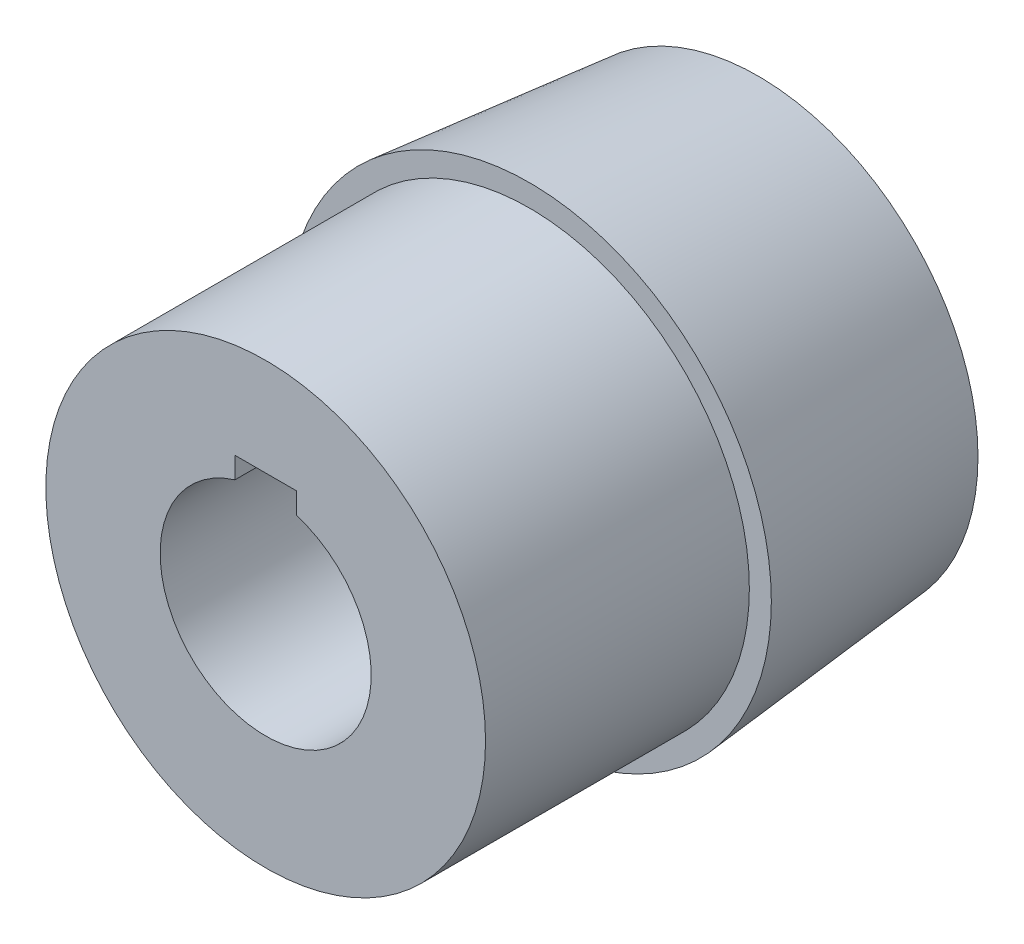
ISO-10303-21;
HEADER;
FILE_DESCRIPTION(('STEP AP214'),'2;1');
FILE_NAME('part.step','',(''),(''),'','','');
FILE_SCHEMA(('AUTOMOTIVE_DESIGN { 1 0 10303 214 1 1 1 1 }'));
ENDSEC;
DATA;
#1=APPLICATION_CONTEXT('core data for automotive mechanical design processes');
#2=APPLICATION_PROTOCOL_DEFINITION('international standard','automotive_design',2000,#1);
#3=PRODUCT_CONTEXT('',#1,'mechanical');
#4=PRODUCT('Part','Part','',(#3));
#5=PRODUCT_RELATED_PRODUCT_CATEGORY('part','',(#4));
#6=PRODUCT_DEFINITION_FORMATION('','',#4);
#7=PRODUCT_DEFINITION_CONTEXT('part definition',#1,'design');
#8=PRODUCT_DEFINITION('design','',#6,#7);
#9=PRODUCT_DEFINITION_SHAPE('','',#8);
#10=(LENGTH_UNIT() NAMED_UNIT(*) SI_UNIT(.MILLI.,.METRE.));
#11=(NAMED_UNIT(*) PLANE_ANGLE_UNIT() SI_UNIT($,.RADIAN.));
#12=(NAMED_UNIT(*) SI_UNIT($,.STERADIAN.) SOLID_ANGLE_UNIT());
#13=UNCERTAINTY_MEASURE_WITH_UNIT(LENGTH_MEASURE(1.E-05),#10,'distance_accuracy_value','');
#14=(GEOMETRIC_REPRESENTATION_CONTEXT(3) GLOBAL_UNCERTAINTY_ASSIGNED_CONTEXT((#13)) GLOBAL_UNIT_ASSIGNED_CONTEXT((#10,
#11,#12)) REPRESENTATION_CONTEXT('',''));
#15=CARTESIAN_POINT('',(0.,0.,0.));
#16=DIRECTION('',(0.,0.,1.));
#17=DIRECTION('',(1.,0.,0.));
#18=AXIS2_PLACEMENT_3D('',#15,#16,#17);
#19=CARTESIAN_POINT('',(0.,0.,56.));
#20=DIRECTION('',(0.,0.,1.));
#21=DIRECTION('',(1.,0.,0.));
#22=AXIS2_PLACEMENT_3D('',#19,#20,#21);
#23=PLANE('',#22);
#24=DIRECTION('',(0.,1.,0.));
#25=VECTOR('',#24,1.);
#26=CARTESIAN_POINT('',(7.,20.2,56.));
#27=LINE('',#26,#25);
#28=CARTESIAN_POINT('',(7.,22.956480566498,56.));
#29=VERTEX_POINT('',#28);
#30=CARTESIAN_POINT('',(7.,27.8,56.));
#31=VERTEX_POINT('',#30);
#32=EDGE_CURVE('E127',#29,#31,#27,.T.);
#33=ORIENTED_EDGE('',*,*,#32,.F.);
#34=CARTESIAN_POINT('',(0.,0.,56.));
#35=DIRECTION('',(0.,0.,1.));
#36=DIRECTION('',(1.,0.,0.));
#37=AXIS2_PLACEMENT_3D('',#34,#35,#36);
#38=CIRCLE('',#37,24.);
#39=CARTESIAN_POINT('',(-7.,22.956480566498,56.));
#40=VERTEX_POINT('',#39);
#41=EDGE_CURVE('E146',#40,#29,#38,.T.);
#42=ORIENTED_EDGE('',*,*,#41,.F.);
#43=DIRECTION('',(0.,-1.,0.));
#44=VECTOR('',#43,1.);
#45=CARTESIAN_POINT('',(-7.,20.2,56.));
#46=LINE('',#45,#44);
#47=CARTESIAN_POINT('',(-7.,27.8,56.));
#48=VERTEX_POINT('',#47);
#49=EDGE_CURVE('E68',#48,#40,#46,.T.);
#50=ORIENTED_EDGE('',*,*,#49,.F.);
#51=DIRECTION('',(-1.,0.,0.));
#52=VECTOR('',#51,1.);
#53=CARTESIAN_POINT('',(-7.,27.8,56.));
#54=LINE('',#53,#52);
#55=EDGE_CURVE('E140',#31,#48,#54,.T.);
#56=ORIENTED_EDGE('',*,*,#55,.F.);
#57=EDGE_LOOP('',(#33,#42,#50,#56));
#58=FACE_BOUND('',#57,.T.);
#59=CARTESIAN_POINT('',(0.,0.,56.));
#60=DIRECTION('',(0.,0.,1.));
#61=DIRECTION('',(1.,0.,0.));
#62=AXIS2_PLACEMENT_3D('',#59,#60,#61);
#63=CIRCLE('',#62,50.);
#64=CARTESIAN_POINT('',(50.,0.,56.));
#65=VERTEX_POINT('',#64);
#66=EDGE_CURVE('E123',#65,#65,#63,.T.);
#67=ORIENTED_EDGE('',*,*,#66,.T.);
#68=EDGE_LOOP('',(#67));
#69=FACE_BOUND('',#68,.T.);
#70=ADVANCED_FACE('F53',(#58,#69),#23,.T.);
#71=CARTESIAN_POINT('',(0.,0.,-56.));
#72=DIRECTION('',(0.,0.,1.));
#73=DIRECTION('',(1.,0.,0.));
#74=AXIS2_PLACEMENT_3D('',#71,#72,#73);
#75=PLANE('',#74);
#76=CARTESIAN_POINT('',(37.,0.,-56.));
#77=DIRECTION('',(0.,0.,-1.));
#78=DIRECTION('',(-1.,0.,0.));
#79=AXIS2_PLACEMENT_3D('',#76,#77,#78);
#80=CIRCLE('',#79,4.5);
#81=CARTESIAN_POINT('',(32.5,0.,-56.));
#82=VERTEX_POINT('',#81);
#83=EDGE_CURVE('E107',#82,#82,#80,.T.);
#84=ORIENTED_EDGE('',*,*,#83,.F.);
#85=EDGE_LOOP('',(#84));
#86=FACE_BOUND('',#85,.T.);
#87=CARTESIAN_POINT('',(-37.,0.,-56.));
#88=DIRECTION('',(0.,0.,-1.));
#89=DIRECTION('',(-1.,0.,0.));
#90=AXIS2_PLACEMENT_3D('',#87,#88,#89);
#91=CIRCLE('',#90,4.5);
#92=CARTESIAN_POINT('',(-41.5,0.,-56.));
#93=VERTEX_POINT('',#92);
#94=EDGE_CURVE('E106',#93,#93,#91,.T.);
#95=ORIENTED_EDGE('',*,*,#94,.F.);
#96=EDGE_LOOP('',(#95));
#97=FACE_BOUND('',#96,.T.);
#98=CARTESIAN_POINT('',(0.,0.,-56.));
#99=DIRECTION('',(0.,0.,1.));
#100=DIRECTION('',(1.,0.,0.));
#101=AXIS2_PLACEMENT_3D('',#98,#99,#100);
#102=CIRCLE('',#101,50.);
#103=CARTESIAN_POINT('',(50.,0.,-56.));
#104=VERTEX_POINT('',#103);
#105=EDGE_CURVE('E117',#104,#104,#102,.T.);
#106=ORIENTED_EDGE('',*,*,#105,.F.);
#107=EDGE_LOOP('',(#106));
#108=FACE_BOUND('',#107,.T.);
#109=CARTESIAN_POINT('',(0.,0.,-56.));
#110=DIRECTION('',(0.,0.,1.));
#111=DIRECTION('',(1.,0.,0.));
#112=AXIS2_PLACEMENT_3D('',#109,#110,#111);
#113=CIRCLE('',#112,24.);
#114=CARTESIAN_POINT('',(-7.,22.956480566498,-56.));
#115=VERTEX_POINT('',#114);
#116=CARTESIAN_POINT('',(7.,22.956480566498,-56.));
#117=VERTEX_POINT('',#116);
#118=EDGE_CURVE('E149',#115,#117,#113,.T.);
#119=ORIENTED_EDGE('',*,*,#118,.T.);
#120=DIRECTION('',(0.,1.,0.));
#121=VECTOR('',#120,1.);
#122=CARTESIAN_POINT('',(7.,20.2,-56.));
#123=LINE('',#122,#121);
#124=CARTESIAN_POINT('',(7.,27.8,-56.));
#125=VERTEX_POINT('',#124);
#126=EDGE_CURVE('E130',#117,#125,#123,.T.);
#127=ORIENTED_EDGE('',*,*,#126,.T.);
#128=DIRECTION('',(-1.,0.,0.));
#129=VECTOR('',#128,1.);
#130=CARTESIAN_POINT('',(-7.,27.8,-56.));
#131=LINE('',#130,#129);
#132=CARTESIAN_POINT('',(-7.,27.8,-56.));
#133=VERTEX_POINT('',#132);
#134=EDGE_CURVE('E133',#125,#133,#131,.T.);
#135=ORIENTED_EDGE('',*,*,#134,.T.);
#136=DIRECTION('',(0.,-1.,0.));
#137=VECTOR('',#136,1.);
#138=CARTESIAN_POINT('',(-7.,20.2,-56.));
#139=LINE('',#138,#137);
#140=EDGE_CURVE('E136',#133,#115,#139,.T.);
#141=ORIENTED_EDGE('',*,*,#140,.T.);
#142=EDGE_LOOP('',(#119,#127,#135,#141));
#143=FACE_BOUND('',#142,.T.);
#144=ADVANCED_FACE('F55',(#86,#97,#108,#143),#75,.F.);
#145=CARTESIAN_POINT('',(0.,0.,-56.));
#146=DIRECTION('',(0.,0.,1.));
#147=DIRECTION('',(1.,0.,0.));
#148=AXIS2_PLACEMENT_3D('',#145,#146,#147);
#149=CYLINDRICAL_SURFACE('',#148,24.);
#150=ORIENTED_EDGE('',*,*,#41,.T.);
#151=DIRECTION('',(0.,0.,1.));
#152=VECTOR('',#151,1.);
#153=CARTESIAN_POINT('',(7.,22.956480566498,-56.));
#154=LINE('',#153,#152);
#155=EDGE_CURVE('E13',#29,#117,#154,.F.);
#156=ORIENTED_EDGE('',*,*,#155,.T.);
#157=ORIENTED_EDGE('',*,*,#118,.F.);
#158=DIRECTION('',(0.,0.,1.));
#159=VECTOR('',#158,1.);
#160=CARTESIAN_POINT('',(-7.,22.956480566498,-56.));
#161=LINE('',#160,#159);
#162=EDGE_CURVE('E61',#115,#40,#161,.T.);
#163=ORIENTED_EDGE('',*,*,#162,.T.);
#164=EDGE_LOOP('',(#150,#156,#157,#163));
#165=FACE_BOUND('',#164,.T.);
#166=ADVANCED_FACE('F156',(#165),#149,.F.);
#167=CARTESIAN_POINT('',(7.,20.2,-56.));
#168=DIRECTION('',(1.,0.,0.));
#169=DIRECTION('',(0.,1.,0.));
#170=AXIS2_PLACEMENT_3D('',#167,#168,#169);
#171=PLANE('',#170);
#172=ORIENTED_EDGE('',*,*,#32,.T.);
#173=DIRECTION('',(0.,0.,1.));
#174=VECTOR('',#173,1.);
#175=CARTESIAN_POINT('',(7.,27.8,-56.));
#176=LINE('',#175,#174);
#177=EDGE_CURVE('E138',#125,#31,#176,.T.);
#178=ORIENTED_EDGE('',*,*,#177,.F.);
#179=ORIENTED_EDGE('',*,*,#126,.F.);
#180=ORIENTED_EDGE('',*,*,#155,.F.);
#181=EDGE_LOOP('',(#172,#178,#179,#180));
#182=FACE_BOUND('',#181,.T.);
#183=ADVANCED_FACE('F162',(#182),#171,.F.);
#184=CARTESIAN_POINT('',(-7.,20.2,-56.));
#185=DIRECTION('',(-1.,0.,0.));
#186=DIRECTION('',(0.,0.,1.));
#187=AXIS2_PLACEMENT_3D('',#184,#185,#186);
#188=PLANE('',#187);
#189=ORIENTED_EDGE('',*,*,#140,.F.);
#190=DIRECTION('',(0.,0.,1.));
#191=VECTOR('',#190,1.);
#192=CARTESIAN_POINT('',(-7.,27.8,-56.));
#193=LINE('',#192,#191);
#194=EDGE_CURVE('E144',#133,#48,#193,.T.);
#195=ORIENTED_EDGE('',*,*,#194,.T.);
#196=ORIENTED_EDGE('',*,*,#49,.T.);
#197=ORIENTED_EDGE('',*,*,#162,.F.);
#198=EDGE_LOOP('',(#189,#195,#196,#197));
#199=FACE_BOUND('',#198,.T.);
#200=ADVANCED_FACE('F167',(#199),#188,.F.);
#201=CARTESIAN_POINT('',(-7.,27.8,-56.));
#202=DIRECTION('',(0.,1.,0.));
#203=DIRECTION('',(0.,0.,1.));
#204=AXIS2_PLACEMENT_3D('',#201,#202,#203);
#205=PLANE('',#204);
#206=ORIENTED_EDGE('',*,*,#55,.T.);
#207=ORIENTED_EDGE('',*,*,#194,.F.);
#208=ORIENTED_EDGE('',*,*,#134,.F.);
#209=ORIENTED_EDGE('',*,*,#177,.T.);
#210=EDGE_LOOP('',(#206,#207,#208,#209));
#211=FACE_BOUND('',#210,.T.);
#212=ADVANCED_FACE('F165',(#211),#205,.F.);
#213=CARTESIAN_POINT('',(0.,0.,-4.));
#214=DIRECTION('',(0.,0.,1.));
#215=DIRECTION('',(1.,0.,0.));
#216=AXIS2_PLACEMENT_3D('',#213,#214,#215);
#217=PLANE('',#216);
#218=CARTESIAN_POINT('',(0.,0.,-4.));
#219=DIRECTION('',(0.,0.,1.));
#220=DIRECTION('',(1.,0.,0.));
#221=AXIS2_PLACEMENT_3D('',#218,#219,#220);
#222=CIRCLE('',#221,50.);
#223=CARTESIAN_POINT('',(50.,0.,-4.));
#224=VERTEX_POINT('',#223);
#225=EDGE_CURVE('E124',#224,#224,#222,.T.);
#226=ORIENTED_EDGE('',*,*,#225,.F.);
#227=EDGE_LOOP('',(#226));
#228=FACE_BOUND('',#227,.T.);
#229=CARTESIAN_POINT('',(0.,0.,-4.));
#230=DIRECTION('',(0.,0.,1.));
#231=DIRECTION('',(1.,0.,0.));
#232=AXIS2_PLACEMENT_3D('',#229,#230,#231);
#233=CIRCLE('',#232,55.);
#234=CARTESIAN_POINT('',(55.,0.,-4.));
#235=VERTEX_POINT('',#234);
#236=EDGE_CURVE('E120',#235,#235,#233,.T.);
#237=ORIENTED_EDGE('',*,*,#236,.T.);
#238=EDGE_LOOP('',(#237));
#239=FACE_BOUND('',#238,.T.);
#240=ADVANCED_FACE('F174',(#228,#239),#217,.T.);
#241=CARTESIAN_POINT('',(0.,0.,-4.));
#242=DIRECTION('',(0.,0.,1.));
#243=DIRECTION('',(1.,0.,0.));
#244=AXIS2_PLACEMENT_3D('',#241,#242,#243);
#245=CYLINDRICAL_SURFACE('',#244,50.);
#246=ORIENTED_EDGE('',*,*,#225,.T.);
#247=EDGE_LOOP('',(#246));
#248=FACE_BOUND('',#247,.T.);
#249=ORIENTED_EDGE('',*,*,#66,.F.);
#250=EDGE_LOOP('',(#249));
#251=FACE_BOUND('',#250,.T.);
#252=ADVANCED_FACE('F216',(#248,#251),#245,.T.);
#253=CARTESIAN_POINT('',(0.,0.,-56.));
#254=DIRECTION('',(0.,0.,1.));
#255=DIRECTION('',(1.,0.,0.));
#256=AXIS2_PLACEMENT_3D('',#253,#254,#255);
#257=CONICAL_SURFACE('',#256,50.,0.0958591471100131);
#258=ORIENTED_EDGE('',*,*,#236,.F.);
#259=EDGE_LOOP('',(#258));
#260=FACE_BOUND('',#259,.T.);
#261=ORIENTED_EDGE('',*,*,#105,.T.);
#262=EDGE_LOOP('',(#261));
#263=FACE_BOUND('',#262,.T.);
#264=ADVANCED_FACE('F225',(#260,#263),#257,.T.);
#265=CARTESIAN_POINT('',(-37.,0.,-28.));
#266=DIRECTION('',(0.,0.,-1.));
#267=DIRECTION('',(-1.,0.,0.));
#268=AXIS2_PLACEMENT_3D('',#265,#266,#267);
#269=CONICAL_SURFACE('',#268,4.5,1.02974425867665);
#270=CARTESIAN_POINT('',(-37.,0.,-25.296127214376));
#271=VERTEX_POINT('',#270);
#272=VERTEX_LOOP('',#271);
#273=FACE_BOUND('',#272,.T.);
#274=CARTESIAN_POINT('',(-37.,0.,-28.));
#275=DIRECTION('',(0.,0.,-1.));
#276=DIRECTION('',(-1.,0.,0.));
#277=AXIS2_PLACEMENT_3D('',#274,#275,#276);
#278=CIRCLE('',#277,4.5);
#279=CARTESIAN_POINT('',(-41.5,0.,-28.));
#280=VERTEX_POINT('',#279);
#281=EDGE_CURVE('E110',#280,#280,#278,.T.);
#282=ORIENTED_EDGE('',*,*,#281,.T.);
#283=EDGE_LOOP('',(#282));
#284=FACE_BOUND('',#283,.T.);
#285=ADVANCED_FACE('F234',(#273,#284),#269,.F.);
#286=CARTESIAN_POINT('',(-37.,0.,-56.));
#287=DIRECTION('',(0.,0.,-1.));
#288=DIRECTION('',(-1.,0.,0.));
#289=AXIS2_PLACEMENT_3D('',#286,#287,#288);
#290=CYLINDRICAL_SURFACE('',#289,4.5);
#291=ORIENTED_EDGE('',*,*,#281,.F.);
#292=EDGE_LOOP('',(#291));
#293=FACE_BOUND('',#292,.T.);
#294=ORIENTED_EDGE('',*,*,#94,.T.);
#295=EDGE_LOOP('',(#294));
#296=FACE_BOUND('',#295,.T.);
#297=ADVANCED_FACE('F100',(#293,#296),#290,.F.);
#298=CARTESIAN_POINT('',(37.,0.,-28.));
#299=DIRECTION('',(0.,0.,-1.));
#300=DIRECTION('',(-1.,0.,0.));
#301=AXIS2_PLACEMENT_3D('',#298,#299,#300);
#302=CONICAL_SURFACE('',#301,4.5,1.02974425867665);
#303=CARTESIAN_POINT('',(37.,0.,-25.296127214376));
#304=VERTEX_POINT('',#303);
#305=VERTEX_LOOP('',#304);
#306=FACE_BOUND('',#305,.T.);
#307=CARTESIAN_POINT('',(37.,0.,-28.));
#308=DIRECTION('',(0.,0.,-1.));
#309=DIRECTION('',(-1.,0.,0.));
#310=AXIS2_PLACEMENT_3D('',#307,#308,#309);
#311=CIRCLE('',#310,4.5);
#312=CARTESIAN_POINT('',(32.5,0.,-28.));
#313=VERTEX_POINT('',#312);
#314=EDGE_CURVE('E104',#313,#313,#311,.T.);
#315=ORIENTED_EDGE('',*,*,#314,.T.);
#316=EDGE_LOOP('',(#315));
#317=FACE_BOUND('',#316,.T.);
#318=ADVANCED_FACE('F96',(#306,#317),#302,.F.);
#319=CARTESIAN_POINT('',(37.,0.,-56.));
#320=DIRECTION('',(0.,0.,-1.));
#321=DIRECTION('',(-1.,0.,0.));
#322=AXIS2_PLACEMENT_3D('',#319,#320,#321);
#323=CYLINDRICAL_SURFACE('',#322,4.5);
#324=ORIENTED_EDGE('',*,*,#314,.F.);
#325=EDGE_LOOP('',(#324));
#326=FACE_BOUND('',#325,.T.);
#327=ORIENTED_EDGE('',*,*,#83,.T.);
#328=EDGE_LOOP('',(#327));
#329=FACE_BOUND('',#328,.T.);
#330=ADVANCED_FACE('F99',(#326,#329),#323,.F.);
#331=CLOSED_SHELL('',(#70,#144,#166,#183,#200,#212,#240,#252,#264,#285,#297,#318,#330));
#332=MANIFOLD_SOLID_BREP('B2',#331);
#333=ADVANCED_BREP_SHAPE_REPRESENTATION('',(#18,#332),#14);
#334=SHAPE_DEFINITION_REPRESENTATION(#9,#333);
ENDSEC;
END-ISO-10303-21;
